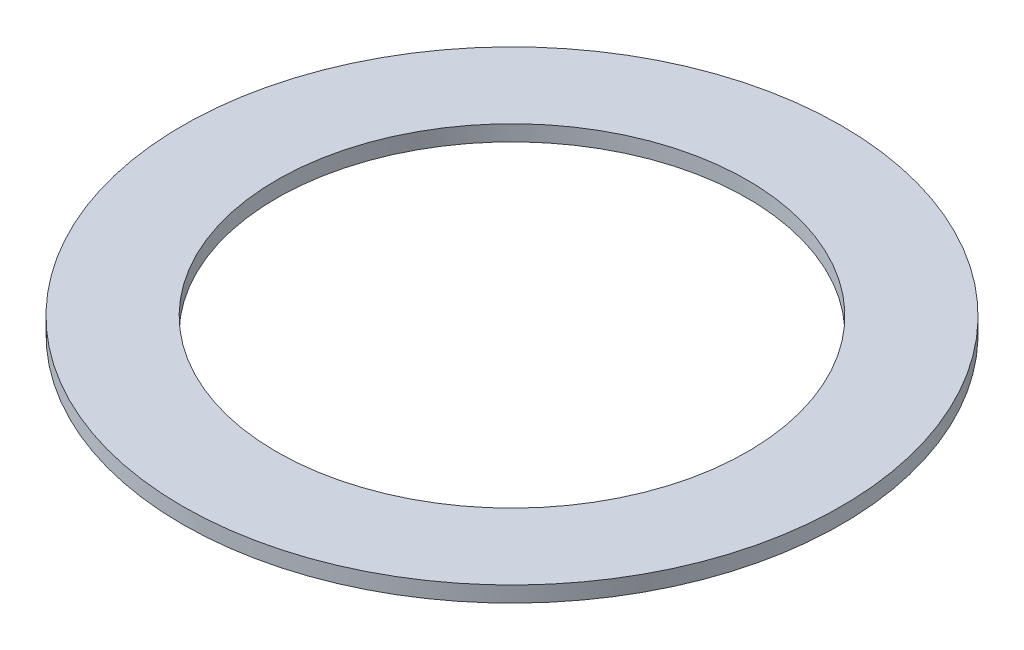
ISO-10303-21;
HEADER;
FILE_DESCRIPTION(('STEP AP214'),'2;1');
FILE_NAME('part.step','',(''),(''),'','','');
FILE_SCHEMA(('AUTOMOTIVE_DESIGN { 1 0 10303 214 1 1 1 1 }'));
ENDSEC;
DATA;
#1=APPLICATION_CONTEXT('core data for automotive mechanical design processes');
#2=APPLICATION_PROTOCOL_DEFINITION('international standard','automotive_design',2000,#1);
#3=PRODUCT_CONTEXT('',#1,'mechanical');
#4=PRODUCT('Part','Part','',(#3));
#5=PRODUCT_RELATED_PRODUCT_CATEGORY('part','',(#4));
#6=PRODUCT_DEFINITION_FORMATION('','',#4);
#7=PRODUCT_DEFINITION_CONTEXT('part definition',#1,'design');
#8=PRODUCT_DEFINITION('design','',#6,#7);
#9=PRODUCT_DEFINITION_SHAPE('','',#8);
#10=(LENGTH_UNIT() NAMED_UNIT(*) SI_UNIT(.MILLI.,.METRE.));
#11=(NAMED_UNIT(*) PLANE_ANGLE_UNIT() SI_UNIT($,.RADIAN.));
#12=(NAMED_UNIT(*) SI_UNIT($,.STERADIAN.) SOLID_ANGLE_UNIT());
#13=UNCERTAINTY_MEASURE_WITH_UNIT(LENGTH_MEASURE(1.E-05),#10,'distance_accuracy_value','');
#14=(GEOMETRIC_REPRESENTATION_CONTEXT(3) GLOBAL_UNCERTAINTY_ASSIGNED_CONTEXT((#13)) GLOBAL_UNIT_ASSIGNED_CONTEXT((#10,
#11,#12)) REPRESENTATION_CONTEXT('',''));
#15=CARTESIAN_POINT('',(0.,0.,0.));
#16=DIRECTION('',(0.,0.,1.));
#17=DIRECTION('',(1.,0.,0.));
#18=AXIS2_PLACEMENT_3D('',#15,#16,#17);
#19=CARTESIAN_POINT('',(0.,1.,0.));
#20=DIRECTION('',(0.,1.,0.));
#21=DIRECTION('',(0.,0.,1.));
#22=AXIS2_PLACEMENT_3D('',#19,#20,#21);
#23=PLANE('',#22);
#24=CARTESIAN_POINT('',(0.,1.,0.));
#25=DIRECTION('',(0.,1.,0.));
#26=DIRECTION('',(0.,0.,1.));
#27=AXIS2_PLACEMENT_3D('',#24,#25,#26);
#28=CIRCLE('',#27,21.);
#29=CARTESIAN_POINT('',(0.,1.,21.));
#30=VERTEX_POINT('',#29);
#31=EDGE_CURVE('E10',#30,#30,#28,.T.);
#32=ORIENTED_EDGE('',*,*,#31,.T.);
#33=EDGE_LOOP('',(#32));
#34=FACE_BOUND('',#33,.T.);
#35=CARTESIAN_POINT('',(0.,1.,0.));
#36=DIRECTION('',(0.,1.,0.));
#37=DIRECTION('',(0.,0.,1.));
#38=AXIS2_PLACEMENT_3D('',#35,#36,#37);
#39=CIRCLE('',#38,15.);
#40=CARTESIAN_POINT('',(0.,1.,15.));
#41=VERTEX_POINT('',#40);
#42=EDGE_CURVE('E48',#41,#41,#39,.T.);
#43=ORIENTED_EDGE('',*,*,#42,.F.);
#44=EDGE_LOOP('',(#43));
#45=FACE_BOUND('',#44,.T.);
#46=ADVANCED_FACE('F37',(#34,#45),#23,.T.);
#47=CARTESIAN_POINT('',(0.,0.,0.));
#48=DIRECTION('',(0.,1.,0.));
#49=DIRECTION('',(0.,0.,1.));
#50=AXIS2_PLACEMENT_3D('',#47,#48,#49);
#51=PLANE('',#50);
#52=CARTESIAN_POINT('',(0.,0.,0.));
#53=DIRECTION('',(0.,1.,0.));
#54=DIRECTION('',(0.,0.,1.));
#55=AXIS2_PLACEMENT_3D('',#52,#53,#54);
#56=CIRCLE('',#55,21.);
#57=CARTESIAN_POINT('',(0.,0.,21.));
#58=VERTEX_POINT('',#57);
#59=EDGE_CURVE('E41',#58,#58,#56,.T.);
#60=ORIENTED_EDGE('',*,*,#59,.F.);
#61=EDGE_LOOP('',(#60));
#62=FACE_BOUND('',#61,.T.);
#63=CARTESIAN_POINT('',(0.,0.,0.));
#64=DIRECTION('',(0.,1.,0.));
#65=DIRECTION('',(0.,0.,1.));
#66=AXIS2_PLACEMENT_3D('',#63,#64,#65);
#67=CIRCLE('',#66,15.);
#68=CARTESIAN_POINT('',(0.,0.,15.));
#69=VERTEX_POINT('',#68);
#70=EDGE_CURVE('E50',#69,#69,#67,.T.);
#71=ORIENTED_EDGE('',*,*,#70,.T.);
#72=EDGE_LOOP('',(#71));
#73=FACE_BOUND('',#72,.T.);
#74=ADVANCED_FACE('F60',(#62,#73),#51,.F.);
#75=CARTESIAN_POINT('',(0.,1.,0.));
#76=DIRECTION('',(0.,-1.,0.));
#77=DIRECTION('',(0.,0.,-1.));
#78=AXIS2_PLACEMENT_3D('',#75,#76,#77);
#79=CYLINDRICAL_SURFACE('',#78,21.);
#80=ORIENTED_EDGE('',*,*,#31,.F.);
#81=EDGE_LOOP('',(#80));
#82=FACE_BOUND('',#81,.T.);
#83=ORIENTED_EDGE('',*,*,#59,.T.);
#84=EDGE_LOOP('',(#83));
#85=FACE_BOUND('',#84,.T.);
#86=ADVANCED_FACE('F39',(#82,#85),#79,.T.);
#87=CARTESIAN_POINT('',(0.,1.,0.));
#88=DIRECTION('',(0.,-1.,0.));
#89=DIRECTION('',(0.,0.,-1.));
#90=AXIS2_PLACEMENT_3D('',#87,#88,#89);
#91=CYLINDRICAL_SURFACE('',#90,15.);
#92=ORIENTED_EDGE('',*,*,#42,.T.);
#93=EDGE_LOOP('',(#92));
#94=FACE_BOUND('',#93,.T.);
#95=ORIENTED_EDGE('',*,*,#70,.F.);
#96=EDGE_LOOP('',(#95));
#97=FACE_BOUND('',#96,.T.);
#98=ADVANCED_FACE('F56',(#94,#97),#91,.F.);
#99=CLOSED_SHELL('',(#46,#74,#86,#98));
#100=MANIFOLD_SOLID_BREP('B2',#99);
#101=ADVANCED_BREP_SHAPE_REPRESENTATION('',(#18,#100),#14);
#102=SHAPE_DEFINITION_REPRESENTATION(#9,#101);
ENDSEC;
END-ISO-10303-21;
